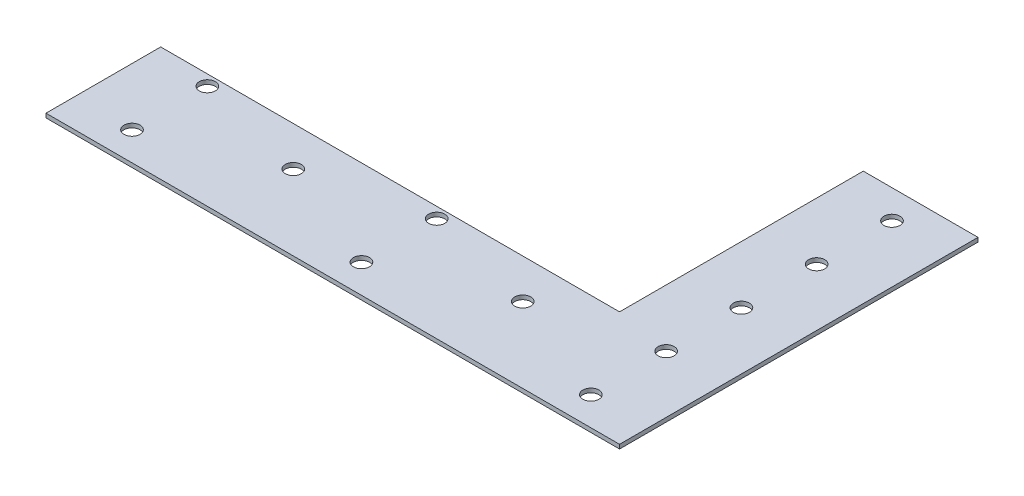
ISO-10303-21;
HEADER;
FILE_DESCRIPTION(('STEP AP214'),'2;1');
FILE_NAME('part.step','',(''),(''),'','','');
FILE_SCHEMA(('AUTOMOTIVE_DESIGN { 1 0 10303 214 1 1 1 1 }'));
ENDSEC;
DATA;
#1=APPLICATION_CONTEXT('core data for automotive mechanical design processes');
#2=APPLICATION_PROTOCOL_DEFINITION('international standard','automotive_design',2000,#1);
#3=PRODUCT_CONTEXT('',#1,'mechanical');
#4=PRODUCT('Part','Part','',(#3));
#5=PRODUCT_RELATED_PRODUCT_CATEGORY('part','',(#4));
#6=PRODUCT_DEFINITION_FORMATION('','',#4);
#7=PRODUCT_DEFINITION_CONTEXT('part definition',#1,'design');
#8=PRODUCT_DEFINITION('design','',#6,#7);
#9=PRODUCT_DEFINITION_SHAPE('','',#8);
#10=(LENGTH_UNIT() NAMED_UNIT(*) SI_UNIT(.MILLI.,.METRE.));
#11=(NAMED_UNIT(*) PLANE_ANGLE_UNIT() SI_UNIT($,.RADIAN.));
#12=(NAMED_UNIT(*) SI_UNIT($,.STERADIAN.) SOLID_ANGLE_UNIT());
#13=UNCERTAINTY_MEASURE_WITH_UNIT(LENGTH_MEASURE(1.E-05),#10,'distance_accuracy_value','');
#14=(GEOMETRIC_REPRESENTATION_CONTEXT(3) GLOBAL_UNCERTAINTY_ASSIGNED_CONTEXT((#13)) GLOBAL_UNIT_ASSIGNED_CONTEXT((#10,
#11,#12)) REPRESENTATION_CONTEXT('',''));
#15=CARTESIAN_POINT('',(0.,0.,0.));
#16=DIRECTION('',(0.,0.,1.));
#17=DIRECTION('',(1.,0.,0.));
#18=AXIS2_PLACEMENT_3D('',#15,#16,#17);
#19=CARTESIAN_POINT('',(0.,0.9144,0.));
#20=DIRECTION('',(0.,1.,0.));
#21=DIRECTION('',(0.,0.,1.));
#22=AXIS2_PLACEMENT_3D('',#19,#20,#21);
#23=PLANE('',#22);
#24=CARTESIAN_POINT('',(50.8,0.9144,-33.3375));
#25=DIRECTION('',(0.,1.,0.));
#26=DIRECTION('',(0.,0.,1.));
#27=AXIS2_PLACEMENT_3D('',#24,#25,#26);
#28=CIRCLE('',#27,1.778);
#29=CARTESIAN_POINT('',(50.8,0.9144,-31.5595));
#30=VERTEX_POINT('',#29);
#31=EDGE_CURVE('E125',#30,#30,#28,.F.);
#32=ORIENTED_EDGE('',*,*,#31,.T.);
#33=EDGE_LOOP('',(#32));
#34=FACE_BOUND('',#33,.T.);
#35=CARTESIAN_POINT('',(25.4,0.9144,23.01875));
#36=DIRECTION('',(0.,1.,0.));
#37=DIRECTION('',(0.,0.,1.));
#38=AXIS2_PLACEMENT_3D('',#35,#36,#37);
#39=CIRCLE('',#38,1.778);
#40=CARTESIAN_POINT('',(25.4,0.9144,24.79675));
#41=VERTEX_POINT('',#40);
#42=EDGE_CURVE('E128',#41,#41,#39,.F.);
#43=ORIENTED_EDGE('',*,*,#42,.T.);
#44=EDGE_LOOP('',(#43));
#45=FACE_BOUND('',#44,.T.);
#46=CARTESIAN_POINT('',(-25.4,0.9144,23.01875));
#47=DIRECTION('',(0.,1.,0.));
#48=DIRECTION('',(0.,0.,1.));
#49=AXIS2_PLACEMENT_3D('',#46,#47,#48);
#50=CIRCLE('',#49,1.778);
#51=CARTESIAN_POINT('',(-25.4,0.9144,24.79675));
#52=VERTEX_POINT('',#51);
#53=EDGE_CURVE('E131',#52,#52,#50,.F.);
#54=ORIENTED_EDGE('',*,*,#53,.T.);
#55=EDGE_LOOP('',(#54));
#56=FACE_BOUND('',#55,.T.);
#57=CARTESIAN_POINT('',(50.8,0.9144,33.3375));
#58=DIRECTION('',(0.,1.,0.));
#59=DIRECTION('',(0.,0.,1.));
#60=AXIS2_PLACEMENT_3D('',#57,#58,#59);
#61=CIRCLE('',#60,1.778);
#62=CARTESIAN_POINT('',(50.8,0.9144,35.1155));
#63=VERTEX_POINT('',#62);
#64=EDGE_CURVE('E134',#63,#63,#61,.F.);
#65=ORIENTED_EDGE('',*,*,#64,.T.);
#66=EDGE_LOOP('',(#65));
#67=FACE_BOUND('',#66,.T.);
#68=CARTESIAN_POINT('',(0.,0.9144,33.3375));
#69=DIRECTION('',(0.,1.,0.));
#70=DIRECTION('',(0.,0.,1.));
#71=AXIS2_PLACEMENT_3D('',#68,#69,#70);
#72=CIRCLE('',#71,1.778);
#73=CARTESIAN_POINT('',(0.,0.9144,35.1155));
#74=VERTEX_POINT('',#73);
#75=EDGE_CURVE('E137',#74,#74,#72,.F.);
#76=ORIENTED_EDGE('',*,*,#75,.T.);
#77=EDGE_LOOP('',(#76));
#78=FACE_BOUND('',#77,.T.);
#79=CARTESIAN_POINT('',(-50.8,0.9144,33.3375));
#80=DIRECTION('',(0.,1.,0.));
#81=DIRECTION('',(0.,0.,1.));
#82=AXIS2_PLACEMENT_3D('',#79,#80,#81);
#83=CIRCLE('',#82,1.778);
#84=CARTESIAN_POINT('',(-50.8,0.9144,35.1155));
#85=VERTEX_POINT('',#84);
#86=EDGE_CURVE('E140',#85,#85,#83,.F.);
#87=ORIENTED_EDGE('',*,*,#86,.T.);
#88=EDGE_LOOP('',(#87));
#89=FACE_BOUND('',#88,.T.);
#90=CARTESIAN_POINT('',(50.8,0.9144,16.66875));
#91=DIRECTION('',(0.,1.,0.));
#92=DIRECTION('',(0.,0.,1.));
#93=AXIS2_PLACEMENT_3D('',#90,#91,#92);
#94=CIRCLE('',#93,1.778);
#95=CARTESIAN_POINT('',(50.8,0.9144,18.44675));
#96=VERTEX_POINT('',#95);
#97=EDGE_CURVE('E143',#96,#96,#94,.F.);
#98=ORIENTED_EDGE('',*,*,#97,.T.);
#99=EDGE_LOOP('',(#98));
#100=FACE_BOUND('',#99,.T.);
#101=CARTESIAN_POINT('',(0.,0.9144,16.66875));
#102=DIRECTION('',(0.,1.,0.));
#103=DIRECTION('',(0.,0.,1.));
#104=AXIS2_PLACEMENT_3D('',#101,#102,#103);
#105=CIRCLE('',#104,1.778);
#106=CARTESIAN_POINT('',(0.,0.9144,18.44675));
#107=VERTEX_POINT('',#106);
#108=EDGE_CURVE('E146',#107,#107,#105,.F.);
#109=ORIENTED_EDGE('',*,*,#108,.T.);
#110=EDGE_LOOP('',(#109));
#111=FACE_BOUND('',#110,.T.);
#112=CARTESIAN_POINT('',(-50.8,0.9144,16.66875));
#113=DIRECTION('',(0.,1.,0.));
#114=DIRECTION('',(0.,0.,1.));
#115=AXIS2_PLACEMENT_3D('',#112,#113,#114);
#116=CIRCLE('',#115,1.778);
#117=CARTESIAN_POINT('',(-50.8,0.9144,18.44675));
#118=VERTEX_POINT('',#117);
#119=EDGE_CURVE('E149',#118,#118,#116,.F.);
#120=ORIENTED_EDGE('',*,*,#119,.T.);
#121=EDGE_LOOP('',(#120));
#122=FACE_BOUND('',#121,.T.);
#123=CARTESIAN_POINT('',(50.8,0.9144,0.));
#124=DIRECTION('',(0.,1.,0.));
#125=DIRECTION('',(0.,0.,1.));
#126=AXIS2_PLACEMENT_3D('',#123,#124,#125);
#127=CIRCLE('',#126,1.778);
#128=CARTESIAN_POINT('',(50.8,0.9144,1.778));
#129=VERTEX_POINT('',#128);
#130=EDGE_CURVE('E151',#129,#129,#127,.F.);
#131=ORIENTED_EDGE('',*,*,#130,.T.);
#132=EDGE_LOOP('',(#131));
#133=FACE_BOUND('',#132,.T.);
#134=CARTESIAN_POINT('',(50.8,0.9144,-16.66875));
#135=DIRECTION('',(0.,1.,0.));
#136=DIRECTION('',(0.,0.,1.));
#137=AXIS2_PLACEMENT_3D('',#134,#135,#136);
#138=CIRCLE('',#137,1.778);
#139=CARTESIAN_POINT('',(50.8,0.9144,-14.89075));
#140=VERTEX_POINT('',#139);
#141=EDGE_CURVE('E19',#140,#140,#138,.F.);
#142=ORIENTED_EDGE('',*,*,#141,.T.);
#143=EDGE_LOOP('',(#142));
#144=FACE_BOUND('',#143,.T.);
#145=DIRECTION('',(-1.,0.,0.));
#146=VECTOR('',#145,1.);
#147=CARTESIAN_POINT('',(63.5,0.9144,-39.6875));
#148=LINE('',#147,#146);
#149=CARTESIAN_POINT('',(38.1,0.9144,-39.6875));
#150=VERTEX_POINT('',#149);
#151=CARTESIAN_POINT('',(63.5,0.9144,-39.6875));
#152=VERTEX_POINT('',#151);
#153=EDGE_CURVE('E76',#150,#152,#148,.F.);
#154=ORIENTED_EDGE('',*,*,#153,.F.);
#155=DIRECTION('',(0.,0.,-1.));
#156=VECTOR('',#155,1.);
#157=CARTESIAN_POINT('',(38.1,0.9144,-39.6875));
#158=LINE('',#157,#156);
#159=CARTESIAN_POINT('',(38.1,0.9144,14.2875));
#160=VERTEX_POINT('',#159);
#161=EDGE_CURVE('E71',#150,#160,#158,.F.);
#162=ORIENTED_EDGE('',*,*,#161,.T.);
#163=DIRECTION('',(1.,0.,0.));
#164=VECTOR('',#163,1.);
#165=CARTESIAN_POINT('',(38.1,0.9144,14.2875));
#166=LINE('',#165,#164);
#167=CARTESIAN_POINT('',(-63.5,0.9144,14.2875));
#168=VERTEX_POINT('',#167);
#169=EDGE_CURVE('E73',#160,#168,#166,.F.);
#170=ORIENTED_EDGE('',*,*,#169,.T.);
#171=DIRECTION('',(0.,0.,1.));
#172=VECTOR('',#171,1.);
#173=CARTESIAN_POINT('',(-63.5,0.9144,-39.6875));
#174=LINE('',#173,#172);
#175=CARTESIAN_POINT('',(-63.5,0.9144,39.6875));
#176=VERTEX_POINT('',#175);
#177=EDGE_CURVE('E66',#176,#168,#174,.F.);
#178=ORIENTED_EDGE('',*,*,#177,.F.);
#179=DIRECTION('',(1.,0.,0.));
#180=VECTOR('',#179,1.);
#181=CARTESIAN_POINT('',(-63.5,0.9144,39.6875));
#182=LINE('',#181,#180);
#183=CARTESIAN_POINT('',(63.5,0.9144,39.6875));
#184=VERTEX_POINT('',#183);
#185=EDGE_CURVE('E171',#184,#176,#182,.F.);
#186=ORIENTED_EDGE('',*,*,#185,.F.);
#187=DIRECTION('',(0.,0.,-1.));
#188=VECTOR('',#187,1.);
#189=CARTESIAN_POINT('',(63.5,0.9144,39.6875));
#190=LINE('',#189,#188);
#191=EDGE_CURVE('E167',#152,#184,#190,.F.);
#192=ORIENTED_EDGE('',*,*,#191,.F.);
#193=EDGE_LOOP('',(#154,#162,#170,#178,#186,#192));
#194=FACE_BOUND('',#193,.T.);
#195=ADVANCED_FACE('F16',(#34,#45,#56,#67,#78,#89,#100,#111,#122,#133,#144,#194),#23,.T.);
#196=CARTESIAN_POINT('',(38.1,0.,-39.6875));
#197=DIRECTION('',(1.,0.,0.));
#198=DIRECTION('',(0.,0.,-1.));
#199=AXIS2_PLACEMENT_3D('',#196,#197,#198);
#200=PLANE('',#199);
#201=ORIENTED_EDGE('',*,*,#161,.F.);
#202=DIRECTION('',(0.,1.,0.));
#203=VECTOR('',#202,1.);
#204=CARTESIAN_POINT('',(38.1,0.,-39.6875));
#205=LINE('',#204,#203);
#206=CARTESIAN_POINT('',(38.1,0.,-39.6875));
#207=VERTEX_POINT('',#206);
#208=EDGE_CURVE('E156',#207,#150,#205,.T.);
#209=ORIENTED_EDGE('',*,*,#208,.F.);
#210=DIRECTION('',(0.,0.,1.));
#211=VECTOR('',#210,1.);
#212=CARTESIAN_POINT('',(38.1,0.,0.));
#213=LINE('',#212,#211);
#214=CARTESIAN_POINT('',(38.1,0.,14.2875));
#215=VERTEX_POINT('',#214);
#216=EDGE_CURVE('E91',#207,#215,#213,.T.);
#217=ORIENTED_EDGE('',*,*,#216,.T.);
#218=DIRECTION('',(0.,1.,0.));
#219=VECTOR('',#218,1.);
#220=CARTESIAN_POINT('',(38.1,0.,14.2875));
#221=LINE('',#220,#219);
#222=EDGE_CURVE('E81',#215,#160,#221,.T.);
#223=ORIENTED_EDGE('',*,*,#222,.T.);
#224=EDGE_LOOP('',(#201,#209,#217,#223));
#225=FACE_BOUND('',#224,.T.);
#226=ADVANCED_FACE('F90',(#225),#200,.F.);
#227=CARTESIAN_POINT('',(38.1,0.,14.2875));
#228=DIRECTION('',(0.,0.,1.));
#229=DIRECTION('',(1.,0.,0.));
#230=AXIS2_PLACEMENT_3D('',#227,#228,#229);
#231=PLANE('',#230);
#232=ORIENTED_EDGE('',*,*,#169,.F.);
#233=ORIENTED_EDGE('',*,*,#222,.F.);
#234=DIRECTION('',(1.,0.,0.));
#235=VECTOR('',#234,1.);
#236=CARTESIAN_POINT('',(0.,0.,14.2875));
#237=LINE('',#236,#235);
#238=CARTESIAN_POINT('',(-63.5,0.,14.2875));
#239=VERTEX_POINT('',#238);
#240=EDGE_CURVE('E181',#215,#239,#237,.F.);
#241=ORIENTED_EDGE('',*,*,#240,.T.);
#242=DIRECTION('',(0.,1.,0.));
#243=VECTOR('',#242,1.);
#244=CARTESIAN_POINT('',(-63.5,0.,14.2875));
#245=LINE('',#244,#243);
#246=EDGE_CURVE('E87',#168,#239,#245,.F.);
#247=ORIENTED_EDGE('',*,*,#246,.F.);
#248=EDGE_LOOP('',(#232,#233,#241,#247));
#249=FACE_BOUND('',#248,.T.);
#250=ADVANCED_FACE('F84',(#249),#231,.F.);
#251=CARTESIAN_POINT('',(-63.5,0.,-39.6875));
#252=DIRECTION('',(-1.,0.,0.));
#253=DIRECTION('',(0.,0.,1.));
#254=AXIS2_PLACEMENT_3D('',#251,#252,#253);
#255=PLANE('',#254);
#256=ORIENTED_EDGE('',*,*,#177,.T.);
#257=ORIENTED_EDGE('',*,*,#246,.T.);
#258=DIRECTION('',(0.,0.,1.));
#259=VECTOR('',#258,1.);
#260=CARTESIAN_POINT('',(-63.5,0.,0.));
#261=LINE('',#260,#259);
#262=CARTESIAN_POINT('',(-63.5,0.,39.6875));
#263=VERTEX_POINT('',#262);
#264=EDGE_CURVE('E176',#239,#263,#261,.T.);
#265=ORIENTED_EDGE('',*,*,#264,.T.);
#266=DIRECTION('',(0.,1.,0.));
#267=VECTOR('',#266,1.);
#268=CARTESIAN_POINT('',(-63.5,0.,39.6875));
#269=LINE('',#268,#267);
#270=EDGE_CURVE('E169',#176,#263,#269,.F.);
#271=ORIENTED_EDGE('',*,*,#270,.F.);
#272=EDGE_LOOP('',(#256,#257,#265,#271));
#273=FACE_BOUND('',#272,.T.);
#274=ADVANCED_FACE('F175',(#273),#255,.T.);
#275=CARTESIAN_POINT('',(-63.5,0.,39.6875));
#276=DIRECTION('',(0.,0.,1.));
#277=DIRECTION('',(1.,0.,0.));
#278=AXIS2_PLACEMENT_3D('',#275,#276,#277);
#279=PLANE('',#278);
#280=ORIENTED_EDGE('',*,*,#270,.T.);
#281=DIRECTION('',(1.,0.,0.));
#282=VECTOR('',#281,1.);
#283=CARTESIAN_POINT('',(0.,0.,39.6875));
#284=LINE('',#283,#282);
#285=CARTESIAN_POINT('',(63.5,0.,39.6875));
#286=VERTEX_POINT('',#285);
#287=EDGE_CURVE('E183',#263,#286,#284,.T.);
#288=ORIENTED_EDGE('',*,*,#287,.T.);
#289=DIRECTION('',(0.,1.,0.));
#290=VECTOR('',#289,1.);
#291=CARTESIAN_POINT('',(63.5,0.,39.6875));
#292=LINE('',#291,#290);
#293=EDGE_CURVE('E165',#184,#286,#292,.F.);
#294=ORIENTED_EDGE('',*,*,#293,.F.);
#295=ORIENTED_EDGE('',*,*,#185,.T.);
#296=EDGE_LOOP('',(#280,#288,#294,#295));
#297=FACE_BOUND('',#296,.T.);
#298=ADVANCED_FACE('F196',(#297),#279,.T.);
#299=CARTESIAN_POINT('',(63.5,0.,39.6875));
#300=DIRECTION('',(1.,0.,0.));
#301=DIRECTION('',(0.,0.,-1.));
#302=AXIS2_PLACEMENT_3D('',#299,#300,#301);
#303=PLANE('',#302);
#304=ORIENTED_EDGE('',*,*,#293,.T.);
#305=DIRECTION('',(0.,0.,1.));
#306=VECTOR('',#305,1.);
#307=CARTESIAN_POINT('',(63.5,0.,0.));
#308=LINE('',#307,#306);
#309=CARTESIAN_POINT('',(63.5,0.,-39.6875));
#310=VERTEX_POINT('',#309);
#311=EDGE_CURVE('E187',#286,#310,#308,.F.);
#312=ORIENTED_EDGE('',*,*,#311,.T.);
#313=DIRECTION('',(0.,1.,0.));
#314=VECTOR('',#313,1.);
#315=CARTESIAN_POINT('',(63.5,0.,-39.6875));
#316=LINE('',#315,#314);
#317=EDGE_CURVE('E34',#152,#310,#316,.F.);
#318=ORIENTED_EDGE('',*,*,#317,.F.);
#319=ORIENTED_EDGE('',*,*,#191,.T.);
#320=EDGE_LOOP('',(#304,#312,#318,#319));
#321=FACE_BOUND('',#320,.T.);
#322=ADVANCED_FACE('F192',(#321),#303,.T.);
#323=CARTESIAN_POINT('',(63.5,0.,-39.6875));
#324=DIRECTION('',(0.,0.,-1.));
#325=DIRECTION('',(-1.,0.,0.));
#326=AXIS2_PLACEMENT_3D('',#323,#324,#325);
#327=PLANE('',#326);
#328=DIRECTION('',(1.,0.,0.));
#329=VECTOR('',#328,1.);
#330=CARTESIAN_POINT('',(0.,0.,-39.6875));
#331=LINE('',#330,#329);
#332=EDGE_CURVE('E124',#310,#207,#331,.F.);
#333=ORIENTED_EDGE('',*,*,#332,.T.);
#334=ORIENTED_EDGE('',*,*,#208,.T.);
#335=ORIENTED_EDGE('',*,*,#153,.T.);
#336=ORIENTED_EDGE('',*,*,#317,.T.);
#337=EDGE_LOOP('',(#333,#334,#335,#336));
#338=FACE_BOUND('',#337,.T.);
#339=ADVANCED_FACE('F190',(#338),#327,.T.);
#340=CARTESIAN_POINT('',(50.8,0.9144,-16.66875));
#341=DIRECTION('',(0.,1.,0.));
#342=DIRECTION('',(0.,0.,1.));
#343=AXIS2_PLACEMENT_3D('',#340,#341,#342);
#344=CYLINDRICAL_SURFACE('',#343,1.778);
#345=ORIENTED_EDGE('',*,*,#141,.F.);
#346=EDGE_LOOP('',(#345));
#347=FACE_BOUND('',#346,.T.);
#348=CARTESIAN_POINT('',(50.8,0.,-16.66875));
#349=DIRECTION('',(0.,1.,0.));
#350=DIRECTION('',(0.,0.,1.));
#351=AXIS2_PLACEMENT_3D('',#348,#349,#350);
#352=CIRCLE('',#351,1.778);
#353=CARTESIAN_POINT('',(50.8,0.,-14.89075));
#354=VERTEX_POINT('',#353);
#355=EDGE_CURVE('E121',#354,#354,#352,.F.);
#356=ORIENTED_EDGE('',*,*,#355,.T.);
#357=EDGE_LOOP('',(#356));
#358=FACE_BOUND('',#357,.T.);
#359=ADVANCED_FACE('F253',(#347,#358),#344,.F.);
#360=CARTESIAN_POINT('',(50.8,0.9144,0.));
#361=DIRECTION('',(0.,1.,0.));
#362=DIRECTION('',(0.,0.,1.));
#363=AXIS2_PLACEMENT_3D('',#360,#361,#362);
#364=CYLINDRICAL_SURFACE('',#363,1.778);
#365=ORIENTED_EDGE('',*,*,#130,.F.);
#366=EDGE_LOOP('',(#365));
#367=FACE_BOUND('',#366,.T.);
#368=CARTESIAN_POINT('',(50.8,0.,0.));
#369=DIRECTION('',(0.,1.,0.));
#370=DIRECTION('',(0.,0.,1.));
#371=AXIS2_PLACEMENT_3D('',#368,#369,#370);
#372=CIRCLE('',#371,1.778);
#373=CARTESIAN_POINT('',(50.8,0.,1.778));
#374=VERTEX_POINT('',#373);
#375=EDGE_CURVE('E118',#374,#374,#372,.F.);
#376=ORIENTED_EDGE('',*,*,#375,.T.);
#377=EDGE_LOOP('',(#376));
#378=FACE_BOUND('',#377,.T.);
#379=ADVANCED_FACE('F249',(#367,#378),#364,.F.);
#380=CARTESIAN_POINT('',(-50.8,0.9144,16.66875));
#381=DIRECTION('',(0.,1.,0.));
#382=DIRECTION('',(0.,0.,1.));
#383=AXIS2_PLACEMENT_3D('',#380,#381,#382);
#384=CYLINDRICAL_SURFACE('',#383,1.778);
#385=ORIENTED_EDGE('',*,*,#119,.F.);
#386=EDGE_LOOP('',(#385));
#387=FACE_BOUND('',#386,.T.);
#388=CARTESIAN_POINT('',(-50.8,0.,16.66875));
#389=DIRECTION('',(0.,1.,0.));
#390=DIRECTION('',(0.,0.,1.));
#391=AXIS2_PLACEMENT_3D('',#388,#389,#390);
#392=CIRCLE('',#391,1.778);
#393=CARTESIAN_POINT('',(-50.8,0.,18.44675));
#394=VERTEX_POINT('',#393);
#395=EDGE_CURVE('E115',#394,#394,#392,.F.);
#396=ORIENTED_EDGE('',*,*,#395,.T.);
#397=EDGE_LOOP('',(#396));
#398=FACE_BOUND('',#397,.T.);
#399=ADVANCED_FACE('F245',(#387,#398),#384,.F.);
#400=CARTESIAN_POINT('',(0.,0.9144,16.66875));
#401=DIRECTION('',(0.,1.,0.));
#402=DIRECTION('',(0.,0.,1.));
#403=AXIS2_PLACEMENT_3D('',#400,#401,#402);
#404=CYLINDRICAL_SURFACE('',#403,1.778);
#405=ORIENTED_EDGE('',*,*,#108,.F.);
#406=EDGE_LOOP('',(#405));
#407=FACE_BOUND('',#406,.T.);
#408=CARTESIAN_POINT('',(0.,0.,16.66875));
#409=DIRECTION('',(0.,1.,0.));
#410=DIRECTION('',(0.,0.,1.));
#411=AXIS2_PLACEMENT_3D('',#408,#409,#410);
#412=CIRCLE('',#411,1.778);
#413=CARTESIAN_POINT('',(0.,0.,18.44675));
#414=VERTEX_POINT('',#413);
#415=EDGE_CURVE('E112',#414,#414,#412,.F.);
#416=ORIENTED_EDGE('',*,*,#415,.T.);
#417=EDGE_LOOP('',(#416));
#418=FACE_BOUND('',#417,.T.);
#419=ADVANCED_FACE('F241',(#407,#418),#404,.F.);
#420=CARTESIAN_POINT('',(50.8,0.9144,16.66875));
#421=DIRECTION('',(0.,1.,0.));
#422=DIRECTION('',(0.,0.,1.));
#423=AXIS2_PLACEMENT_3D('',#420,#421,#422);
#424=CYLINDRICAL_SURFACE('',#423,1.778);
#425=ORIENTED_EDGE('',*,*,#97,.F.);
#426=EDGE_LOOP('',(#425));
#427=FACE_BOUND('',#426,.T.);
#428=CARTESIAN_POINT('',(50.8,0.,16.66875));
#429=DIRECTION('',(0.,1.,0.));
#430=DIRECTION('',(0.,0.,1.));
#431=AXIS2_PLACEMENT_3D('',#428,#429,#430);
#432=CIRCLE('',#431,1.778);
#433=CARTESIAN_POINT('',(50.8,0.,18.44675));
#434=VERTEX_POINT('',#433);
#435=EDGE_CURVE('E109',#434,#434,#432,.F.);
#436=ORIENTED_EDGE('',*,*,#435,.T.);
#437=EDGE_LOOP('',(#436));
#438=FACE_BOUND('',#437,.T.);
#439=ADVANCED_FACE('F237',(#427,#438),#424,.F.);
#440=CARTESIAN_POINT('',(-50.8,0.9144,33.3375));
#441=DIRECTION('',(0.,1.,0.));
#442=DIRECTION('',(0.,0.,1.));
#443=AXIS2_PLACEMENT_3D('',#440,#441,#442);
#444=CYLINDRICAL_SURFACE('',#443,1.778);
#445=ORIENTED_EDGE('',*,*,#86,.F.);
#446=EDGE_LOOP('',(#445));
#447=FACE_BOUND('',#446,.T.);
#448=CARTESIAN_POINT('',(-50.8,0.,33.3375));
#449=DIRECTION('',(0.,1.,0.));
#450=DIRECTION('',(0.,0.,1.));
#451=AXIS2_PLACEMENT_3D('',#448,#449,#450);
#452=CIRCLE('',#451,1.778);
#453=CARTESIAN_POINT('',(-50.8,0.,35.1155));
#454=VERTEX_POINT('',#453);
#455=EDGE_CURVE('E106',#454,#454,#452,.F.);
#456=ORIENTED_EDGE('',*,*,#455,.T.);
#457=EDGE_LOOP('',(#456));
#458=FACE_BOUND('',#457,.T.);
#459=ADVANCED_FACE('F233',(#447,#458),#444,.F.);
#460=CARTESIAN_POINT('',(0.,0.9144,33.3375));
#461=DIRECTION('',(0.,1.,0.));
#462=DIRECTION('',(0.,0.,1.));
#463=AXIS2_PLACEMENT_3D('',#460,#461,#462);
#464=CYLINDRICAL_SURFACE('',#463,1.778);
#465=ORIENTED_EDGE('',*,*,#75,.F.);
#466=EDGE_LOOP('',(#465));
#467=FACE_BOUND('',#466,.T.);
#468=CARTESIAN_POINT('',(0.,0.,33.3375));
#469=DIRECTION('',(0.,1.,0.));
#470=DIRECTION('',(0.,0.,1.));
#471=AXIS2_PLACEMENT_3D('',#468,#469,#470);
#472=CIRCLE('',#471,1.778);
#473=CARTESIAN_POINT('',(0.,0.,35.1155));
#474=VERTEX_POINT('',#473);
#475=EDGE_CURVE('E103',#474,#474,#472,.F.);
#476=ORIENTED_EDGE('',*,*,#475,.T.);
#477=EDGE_LOOP('',(#476));
#478=FACE_BOUND('',#477,.T.);
#479=ADVANCED_FACE('F229',(#467,#478),#464,.F.);
#480=CARTESIAN_POINT('',(50.8,0.9144,33.3375));
#481=DIRECTION('',(0.,1.,0.));
#482=DIRECTION('',(0.,0.,1.));
#483=AXIS2_PLACEMENT_3D('',#480,#481,#482);
#484=CYLINDRICAL_SURFACE('',#483,1.778);
#485=ORIENTED_EDGE('',*,*,#64,.F.);
#486=EDGE_LOOP('',(#485));
#487=FACE_BOUND('',#486,.T.);
#488=CARTESIAN_POINT('',(50.8,0.,33.3375));
#489=DIRECTION('',(0.,1.,0.));
#490=DIRECTION('',(0.,0.,1.));
#491=AXIS2_PLACEMENT_3D('',#488,#489,#490);
#492=CIRCLE('',#491,1.778);
#493=CARTESIAN_POINT('',(50.8,0.,35.1155));
#494=VERTEX_POINT('',#493);
#495=EDGE_CURVE('E100',#494,#494,#492,.F.);
#496=ORIENTED_EDGE('',*,*,#495,.T.);
#497=EDGE_LOOP('',(#496));
#498=FACE_BOUND('',#497,.T.);
#499=ADVANCED_FACE('F225',(#487,#498),#484,.F.);
#500=CARTESIAN_POINT('',(-25.4,0.9144,23.01875));
#501=DIRECTION('',(0.,1.,0.));
#502=DIRECTION('',(0.,0.,1.));
#503=AXIS2_PLACEMENT_3D('',#500,#501,#502);
#504=CYLINDRICAL_SURFACE('',#503,1.778);
#505=ORIENTED_EDGE('',*,*,#53,.F.);
#506=EDGE_LOOP('',(#505));
#507=FACE_BOUND('',#506,.T.);
#508=CARTESIAN_POINT('',(-25.4,0.,23.01875));
#509=DIRECTION('',(0.,1.,0.));
#510=DIRECTION('',(0.,0.,1.));
#511=AXIS2_PLACEMENT_3D('',#508,#509,#510);
#512=CIRCLE('',#511,1.778);
#513=CARTESIAN_POINT('',(-25.4,0.,24.79675));
#514=VERTEX_POINT('',#513);
#515=EDGE_CURVE('E97',#514,#514,#512,.F.);
#516=ORIENTED_EDGE('',*,*,#515,.T.);
#517=EDGE_LOOP('',(#516));
#518=FACE_BOUND('',#517,.T.);
#519=ADVANCED_FACE('F221',(#507,#518),#504,.F.);
#520=CARTESIAN_POINT('',(25.4,0.9144,23.01875));
#521=DIRECTION('',(0.,1.,0.));
#522=DIRECTION('',(0.,0.,1.));
#523=AXIS2_PLACEMENT_3D('',#520,#521,#522);
#524=CYLINDRICAL_SURFACE('',#523,1.778);
#525=ORIENTED_EDGE('',*,*,#42,.F.);
#526=EDGE_LOOP('',(#525));
#527=FACE_BOUND('',#526,.T.);
#528=CARTESIAN_POINT('',(25.4,0.,23.01875));
#529=DIRECTION('',(0.,1.,0.));
#530=DIRECTION('',(0.,0.,1.));
#531=AXIS2_PLACEMENT_3D('',#528,#529,#530);
#532=CIRCLE('',#531,1.778);
#533=CARTESIAN_POINT('',(25.4,0.,24.79675));
#534=VERTEX_POINT('',#533);
#535=EDGE_CURVE('E25',#534,#534,#532,.F.);
#536=ORIENTED_EDGE('',*,*,#535,.T.);
#537=EDGE_LOOP('',(#536));
#538=FACE_BOUND('',#537,.T.);
#539=ADVANCED_FACE('F213',(#527,#538),#524,.F.);
#540=CARTESIAN_POINT('',(50.8,0.9144,-33.3375));
#541=DIRECTION('',(0.,1.,0.));
#542=DIRECTION('',(0.,0.,1.));
#543=AXIS2_PLACEMENT_3D('',#540,#541,#542);
#544=CYLINDRICAL_SURFACE('',#543,1.778);
#545=ORIENTED_EDGE('',*,*,#31,.F.);
#546=EDGE_LOOP('',(#545));
#547=FACE_BOUND('',#546,.T.);
#548=CARTESIAN_POINT('',(50.8,0.,-33.3375));
#549=DIRECTION('',(0.,1.,0.));
#550=DIRECTION('',(0.,0.,1.));
#551=AXIS2_PLACEMENT_3D('',#548,#549,#550);
#552=CIRCLE('',#551,1.778);
#553=CARTESIAN_POINT('',(50.8,0.,-31.5595));
#554=VERTEX_POINT('',#553);
#555=EDGE_CURVE('E11',#554,#554,#552,.F.);
#556=ORIENTED_EDGE('',*,*,#555,.T.);
#557=EDGE_LOOP('',(#556));
#558=FACE_BOUND('',#557,.T.);
#559=ADVANCED_FACE('F207',(#547,#558),#544,.F.);
#560=CARTESIAN_POINT('',(0.,0.,0.));
#561=DIRECTION('',(0.,1.,0.));
#562=DIRECTION('',(0.,0.,1.));
#563=AXIS2_PLACEMENT_3D('',#560,#561,#562);
#564=PLANE('',#563);
#565=ORIENTED_EDGE('',*,*,#555,.F.);
#566=EDGE_LOOP('',(#565));
#567=FACE_BOUND('',#566,.T.);
#568=ORIENTED_EDGE('',*,*,#535,.F.);
#569=EDGE_LOOP('',(#568));
#570=FACE_BOUND('',#569,.T.);
#571=ORIENTED_EDGE('',*,*,#515,.F.);
#572=EDGE_LOOP('',(#571));
#573=FACE_BOUND('',#572,.T.);
#574=ORIENTED_EDGE('',*,*,#495,.F.);
#575=EDGE_LOOP('',(#574));
#576=FACE_BOUND('',#575,.T.);
#577=ORIENTED_EDGE('',*,*,#475,.F.);
#578=EDGE_LOOP('',(#577));
#579=FACE_BOUND('',#578,.T.);
#580=ORIENTED_EDGE('',*,*,#455,.F.);
#581=EDGE_LOOP('',(#580));
#582=FACE_BOUND('',#581,.T.);
#583=ORIENTED_EDGE('',*,*,#435,.F.);
#584=EDGE_LOOP('',(#583));
#585=FACE_BOUND('',#584,.T.);
#586=ORIENTED_EDGE('',*,*,#415,.F.);
#587=EDGE_LOOP('',(#586));
#588=FACE_BOUND('',#587,.T.);
#589=ORIENTED_EDGE('',*,*,#395,.F.);
#590=EDGE_LOOP('',(#589));
#591=FACE_BOUND('',#590,.T.);
#592=ORIENTED_EDGE('',*,*,#375,.F.);
#593=EDGE_LOOP('',(#592));
#594=FACE_BOUND('',#593,.T.);
#595=ORIENTED_EDGE('',*,*,#355,.F.);
#596=EDGE_LOOP('',(#595));
#597=FACE_BOUND('',#596,.T.);
#598=ORIENTED_EDGE('',*,*,#311,.F.);
#599=ORIENTED_EDGE('',*,*,#287,.F.);
#600=ORIENTED_EDGE('',*,*,#264,.F.);
#601=ORIENTED_EDGE('',*,*,#240,.F.);
#602=ORIENTED_EDGE('',*,*,#216,.F.);
#603=ORIENTED_EDGE('',*,*,#332,.F.);
#604=EDGE_LOOP('',(#598,#599,#600,#601,#602,#603));
#605=FACE_BOUND('',#604,.T.);
#606=ADVANCED_FACE('F180',(#567,#570,#573,#576,#579,#582,#585,#588,#591,#594,#597,#605),#564,.F.);
#607=CLOSED_SHELL('',(#195,#226,#250,#274,#298,#322,#339,#359,#379,#399,#419,#439,#459,#479,
#499,#519,#539,#559,#606));
#608=MANIFOLD_SOLID_BREP('B1',#607);
#609=ADVANCED_BREP_SHAPE_REPRESENTATION('',(#18,#608),#14);
#610=SHAPE_DEFINITION_REPRESENTATION(#9,#609);
ENDSEC;
END-ISO-10303-21;
